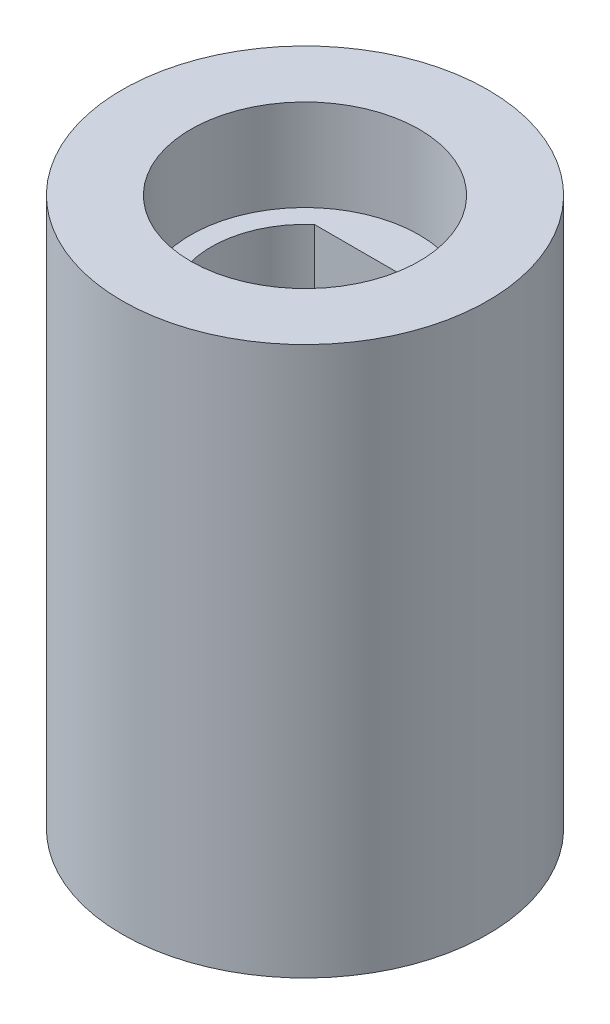
ISO-10303-21;
HEADER;
FILE_DESCRIPTION(('STEP AP214'),'2;1');
FILE_NAME('part.step','',(''),(''),'','','');
FILE_SCHEMA(('AUTOMOTIVE_DESIGN { 1 0 10303 214 1 1 1 1 }'));
ENDSEC;
DATA;
#1=APPLICATION_CONTEXT('core data for automotive mechanical design processes');
#2=APPLICATION_PROTOCOL_DEFINITION('international standard','automotive_design',2000,#1);
#3=PRODUCT_CONTEXT('',#1,'mechanical');
#4=PRODUCT('Part','Part','',(#3));
#5=PRODUCT_RELATED_PRODUCT_CATEGORY('part','',(#4));
#6=PRODUCT_DEFINITION_FORMATION('','',#4);
#7=PRODUCT_DEFINITION_CONTEXT('part definition',#1,'design');
#8=PRODUCT_DEFINITION('design','',#6,#7);
#9=PRODUCT_DEFINITION_SHAPE('','',#8);
#10=(LENGTH_UNIT() NAMED_UNIT(*) SI_UNIT(.MILLI.,.METRE.));
#11=(NAMED_UNIT(*) PLANE_ANGLE_UNIT() SI_UNIT($,.RADIAN.));
#12=(NAMED_UNIT(*) SI_UNIT($,.STERADIAN.) SOLID_ANGLE_UNIT());
#13=UNCERTAINTY_MEASURE_WITH_UNIT(LENGTH_MEASURE(1.E-05),#10,'distance_accuracy_value','');
#14=(GEOMETRIC_REPRESENTATION_CONTEXT(3) GLOBAL_UNCERTAINTY_ASSIGNED_CONTEXT((#13)) GLOBAL_UNIT_ASSIGNED_CONTEXT((#10,
#11,#12)) REPRESENTATION_CONTEXT('',''));
#15=CARTESIAN_POINT('',(0.,0.,0.));
#16=DIRECTION('',(0.,0.,1.));
#17=DIRECTION('',(1.,0.,0.));
#18=AXIS2_PLACEMENT_3D('',#15,#16,#17);
#19=CARTESIAN_POINT('',(0.,10.,0.));
#20=DIRECTION('',(0.,1.,0.));
#21=DIRECTION('',(0.,0.,1.));
#22=AXIS2_PLACEMENT_3D('',#19,#20,#21);
#23=PLANE('',#22);
#24=DIRECTION('',(-1.,0.,0.));
#25=VECTOR('',#24,1.);
#26=CARTESIAN_POINT('',(-1.34164078649987,10.,-1.55));
#27=LINE('',#26,#25);
#28=CARTESIAN_POINT('',(1.34164078649987,10.,-1.55));
#29=VERTEX_POINT('',#28);
#30=CARTESIAN_POINT('',(-1.34164078649987,10.,-1.55));
#31=VERTEX_POINT('',#30);
#32=EDGE_CURVE('E76',#29,#31,#27,.T.);
#33=ORIENTED_EDGE('',*,*,#32,.F.);
#34=CARTESIAN_POINT('',(0.,10.,0.));
#35=DIRECTION('',(0.,1.,0.));
#36=DIRECTION('',(0.,0.,1.));
#37=AXIS2_PLACEMENT_3D('',#34,#35,#36);
#38=CIRCLE('',#37,2.05);
#39=EDGE_CURVE('E64',#31,#29,#38,.T.);
#40=ORIENTED_EDGE('',*,*,#39,.F.);
#41=EDGE_LOOP('',(#33,#40));
#42=FACE_BOUND('',#41,.T.);
#43=CARTESIAN_POINT('',(0.,10.,0.));
#44=DIRECTION('',(0.,1.,0.));
#45=DIRECTION('',(0.,0.,1.));
#46=AXIS2_PLACEMENT_3D('',#43,#44,#45);
#47=CIRCLE('',#46,2.5);
#48=CARTESIAN_POINT('',(0.,10.,2.5));
#49=VERTEX_POINT('',#48);
#50=EDGE_CURVE('E80',#49,#49,#47,.T.);
#51=ORIENTED_EDGE('',*,*,#50,.T.);
#52=EDGE_LOOP('',(#51));
#53=FACE_BOUND('',#52,.T.);
#54=ADVANCED_FACE('F33',(#42,#53),#23,.T.);
#55=CARTESIAN_POINT('',(0.,0.,0.));
#56=DIRECTION('',(0.,1.,0.));
#57=DIRECTION('',(0.,0.,1.));
#58=AXIS2_PLACEMENT_3D('',#55,#56,#57);
#59=PLANE('',#58);
#60=CARTESIAN_POINT('',(0.,0.,0.));
#61=DIRECTION('',(0.,1.,0.));
#62=DIRECTION('',(0.,0.,1.));
#63=AXIS2_PLACEMENT_3D('',#60,#61,#62);
#64=CIRCLE('',#63,4.);
#65=CARTESIAN_POINT('',(0.,0.,4.));
#66=VERTEX_POINT('',#65);
#67=EDGE_CURVE('E11',#66,#66,#64,.T.);
#68=ORIENTED_EDGE('',*,*,#67,.F.);
#69=EDGE_LOOP('',(#68));
#70=FACE_BOUND('',#69,.T.);
#71=CARTESIAN_POINT('',(0.,0.,0.));
#72=DIRECTION('',(0.,1.,0.));
#73=DIRECTION('',(0.,0.,1.));
#74=AXIS2_PLACEMENT_3D('',#71,#72,#73);
#75=CIRCLE('',#74,2.05);
#76=CARTESIAN_POINT('',(-1.34164078649987,0.,-1.55));
#77=VERTEX_POINT('',#76);
#78=CARTESIAN_POINT('',(1.34164078649987,0.,-1.55));
#79=VERTEX_POINT('',#78);
#80=EDGE_CURVE('E54',#77,#79,#75,.T.);
#81=ORIENTED_EDGE('',*,*,#80,.T.);
#82=DIRECTION('',(-1.,0.,0.));
#83=VECTOR('',#82,1.);
#84=CARTESIAN_POINT('',(-1.34164078649987,0.,-1.55));
#85=LINE('',#84,#83);
#86=EDGE_CURVE('E60',#79,#77,#85,.T.);
#87=ORIENTED_EDGE('',*,*,#86,.T.);
#88=EDGE_LOOP('',(#81,#87));
#89=FACE_BOUND('',#88,.T.);
#90=ADVANCED_FACE('F69',(#70,#89),#59,.F.);
#91=CARTESIAN_POINT('',(0.,10.,0.));
#92=DIRECTION('',(0.,-1.,0.));
#93=DIRECTION('',(0.,0.,-1.));
#94=AXIS2_PLACEMENT_3D('',#91,#92,#93);
#95=CYLINDRICAL_SURFACE('',#94,4.);
#96=ORIENTED_EDGE('',*,*,#67,.T.);
#97=EDGE_LOOP('',(#96));
#98=FACE_BOUND('',#97,.T.);
#99=CARTESIAN_POINT('',(0.,12.,0.));
#100=DIRECTION('',(0.,1.,0.));
#101=DIRECTION('',(0.,0.,1.));
#102=AXIS2_PLACEMENT_3D('',#99,#100,#101);
#103=CIRCLE('',#102,4.);
#104=CARTESIAN_POINT('',(0.,12.,4.));
#105=VERTEX_POINT('',#104);
#106=EDGE_CURVE('E70',#105,#105,#103,.T.);
#107=ORIENTED_EDGE('',*,*,#106,.F.);
#108=EDGE_LOOP('',(#107));
#109=FACE_BOUND('',#108,.T.);
#110=ADVANCED_FACE('F35',(#98,#109),#95,.T.);
#111=CARTESIAN_POINT('',(0.,10.,0.));
#112=DIRECTION('',(0.,-1.,0.));
#113=DIRECTION('',(0.,0.,-1.));
#114=AXIS2_PLACEMENT_3D('',#111,#112,#113);
#115=CYLINDRICAL_SURFACE('',#114,2.05);
#116=ORIENTED_EDGE('',*,*,#80,.F.);
#117=DIRECTION('',(0.,-1.,0.));
#118=VECTOR('',#117,1.);
#119=CARTESIAN_POINT('',(-1.34164078649987,10.,-1.55));
#120=LINE('',#119,#118);
#121=EDGE_CURVE('E62',#31,#77,#120,.T.);
#122=ORIENTED_EDGE('',*,*,#121,.F.);
#123=ORIENTED_EDGE('',*,*,#39,.T.);
#124=DIRECTION('',(0.,-1.,0.));
#125=VECTOR('',#124,1.);
#126=CARTESIAN_POINT('',(1.34164078649987,10.,-1.55));
#127=LINE('',#126,#125);
#128=EDGE_CURVE('E41',#29,#79,#127,.T.);
#129=ORIENTED_EDGE('',*,*,#128,.T.);
#130=EDGE_LOOP('',(#116,#122,#123,#129));
#131=FACE_BOUND('',#130,.T.);
#132=ADVANCED_FACE('F66',(#131),#115,.F.);
#133=CARTESIAN_POINT('',(-1.34164078649987,10.,-1.55));
#134=DIRECTION('',(0.,0.,1.));
#135=DIRECTION('',(1.,0.,0.));
#136=AXIS2_PLACEMENT_3D('',#133,#134,#135);
#137=PLANE('',#136);
#138=ORIENTED_EDGE('',*,*,#86,.F.);
#139=ORIENTED_EDGE('',*,*,#128,.F.);
#140=ORIENTED_EDGE('',*,*,#32,.T.);
#141=ORIENTED_EDGE('',*,*,#121,.T.);
#142=EDGE_LOOP('',(#138,#139,#140,#141));
#143=FACE_BOUND('',#142,.T.);
#144=ADVANCED_FACE('F61',(#143),#137,.T.);
#145=CARTESIAN_POINT('',(0.,12.,0.));
#146=DIRECTION('',(0.,1.,0.));
#147=DIRECTION('',(0.,0.,1.));
#148=AXIS2_PLACEMENT_3D('',#145,#146,#147);
#149=PLANE('',#148);
#150=ORIENTED_EDGE('',*,*,#106,.T.);
#151=EDGE_LOOP('',(#150));
#152=FACE_BOUND('',#151,.T.);
#153=CARTESIAN_POINT('',(0.,12.,0.));
#154=DIRECTION('',(0.,1.,0.));
#155=DIRECTION('',(0.,0.,1.));
#156=AXIS2_PLACEMENT_3D('',#153,#154,#155);
#157=CIRCLE('',#156,2.5);
#158=CARTESIAN_POINT('',(0.,12.,2.5));
#159=VERTEX_POINT('',#158);
#160=EDGE_CURVE('E73',#159,#159,#157,.T.);
#161=ORIENTED_EDGE('',*,*,#160,.F.);
#162=EDGE_LOOP('',(#161));
#163=FACE_BOUND('',#162,.T.);
#164=ADVANCED_FACE('F89',(#152,#163),#149,.T.);
#165=CARTESIAN_POINT('',(0.,12.,0.));
#166=DIRECTION('',(0.,-1.,0.));
#167=DIRECTION('',(0.,0.,-1.));
#168=AXIS2_PLACEMENT_3D('',#165,#166,#167);
#169=CYLINDRICAL_SURFACE('',#168,2.5);
#170=ORIENTED_EDGE('',*,*,#160,.T.);
#171=EDGE_LOOP('',(#170));
#172=FACE_BOUND('',#171,.T.);
#173=ORIENTED_EDGE('',*,*,#50,.F.);
#174=EDGE_LOOP('',(#173));
#175=FACE_BOUND('',#174,.T.);
#176=ADVANCED_FACE('F86',(#172,#175),#169,.F.);
#177=CLOSED_SHELL('',(#54,#90,#110,#132,#144,#164,#176));
#178=MANIFOLD_SOLID_BREP('B2',#177);
#179=ADVANCED_BREP_SHAPE_REPRESENTATION('',(#18,#178),#14);
#180=SHAPE_DEFINITION_REPRESENTATION(#9,#179);
ENDSEC;
END-ISO-10303-21;
